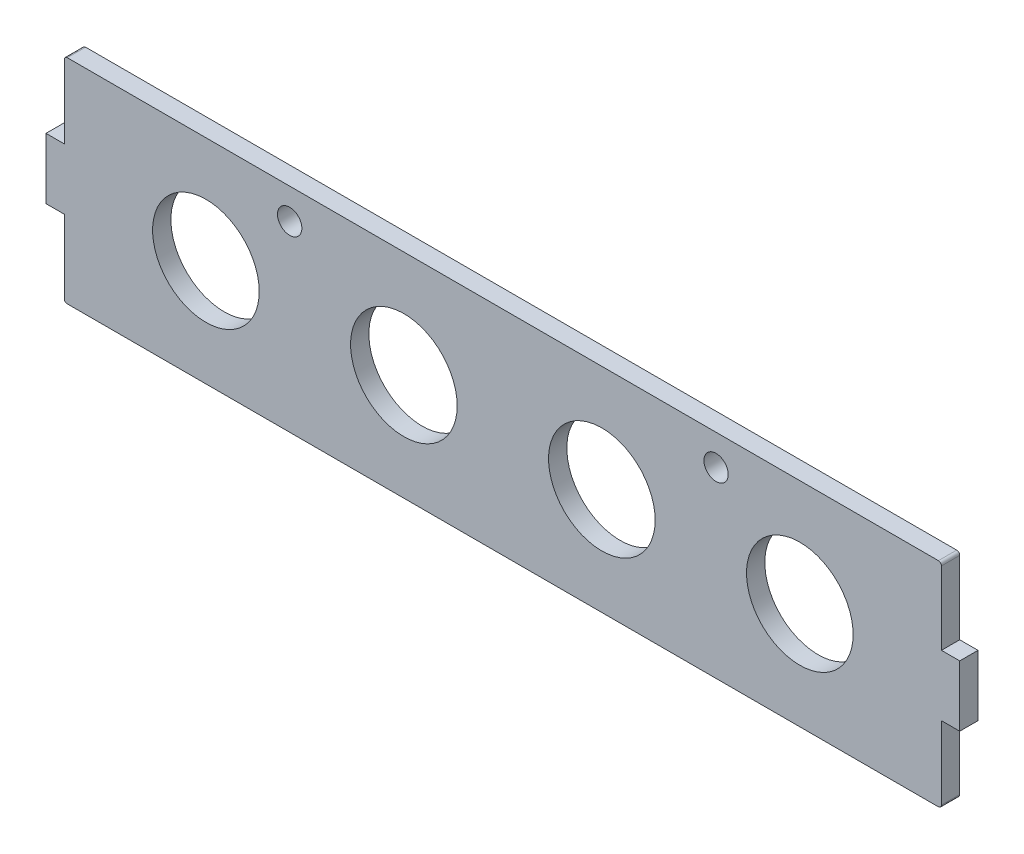
ISO-10303-21;
HEADER;
FILE_DESCRIPTION(('STEP AP214'),'2;1');
FILE_NAME('part.step','',(''),(''),'','','');
FILE_SCHEMA(('AUTOMOTIVE_DESIGN { 1 0 10303 214 1 1 1 1 }'));
ENDSEC;
DATA;
#1=APPLICATION_CONTEXT('core data for automotive mechanical design processes');
#2=APPLICATION_PROTOCOL_DEFINITION('international standard','automotive_design',2000,#1);
#3=PRODUCT_CONTEXT('',#1,'mechanical');
#4=PRODUCT('Part','Part','',(#3));
#5=PRODUCT_RELATED_PRODUCT_CATEGORY('part','',(#4));
#6=PRODUCT_DEFINITION_FORMATION('','',#4);
#7=PRODUCT_DEFINITION_CONTEXT('part definition',#1,'design');
#8=PRODUCT_DEFINITION('design','',#6,#7);
#9=PRODUCT_DEFINITION_SHAPE('','',#8);
#10=(LENGTH_UNIT() NAMED_UNIT(*) SI_UNIT(.MILLI.,.METRE.));
#11=(NAMED_UNIT(*) PLANE_ANGLE_UNIT() SI_UNIT($,.RADIAN.));
#12=(NAMED_UNIT(*) SI_UNIT($,.STERADIAN.) SOLID_ANGLE_UNIT());
#13=UNCERTAINTY_MEASURE_WITH_UNIT(LENGTH_MEASURE(1.E-05),#10,'distance_accuracy_value','');
#14=(GEOMETRIC_REPRESENTATION_CONTEXT(3) GLOBAL_UNCERTAINTY_ASSIGNED_CONTEXT((#13)) GLOBAL_UNIT_ASSIGNED_CONTEXT((#10,
#11,#12)) REPRESENTATION_CONTEXT('',''));
#15=CARTESIAN_POINT('',(0.,0.,0.));
#16=DIRECTION('',(0.,0.,1.));
#17=DIRECTION('',(1.,0.,0.));
#18=AXIS2_PLACEMENT_3D('',#15,#16,#17);
#19=CARTESIAN_POINT('',(0.,0.,-6.));
#20=DIRECTION('',(-1.,0.,0.));
#21=DIRECTION('',(0.,0.,1.));
#22=AXIS2_PLACEMENT_3D('',#19,#20,#21);
#23=PLANE('',#22);
#24=DIRECTION('',(0.,-1.,0.));
#25=VECTOR('',#24,1.);
#26=CARTESIAN_POINT('',(0.,0.,-6.));
#27=LINE('',#26,#25);
#28=CARTESIAN_POINT('',(0.,45.,-6.));
#29=VERTEX_POINT('',#28);
#30=CARTESIAN_POINT('',(0.,25.,-6.));
#31=VERTEX_POINT('',#30);
#32=EDGE_CURVE('E220',#29,#31,#27,.T.);
#33=ORIENTED_EDGE('',*,*,#32,.T.);
#34=DIRECTION('',(0.,0.,1.));
#35=VECTOR('',#34,1.);
#36=CARTESIAN_POINT('',(0.,25.,-6.));
#37=LINE('',#36,#35);
#38=CARTESIAN_POINT('',(0.,25.,0.));
#39=VERTEX_POINT('',#38);
#40=EDGE_CURVE('E186',#31,#39,#37,.T.);
#41=ORIENTED_EDGE('',*,*,#40,.T.);
#42=DIRECTION('',(0.,-1.,0.));
#43=VECTOR('',#42,1.);
#44=CARTESIAN_POINT('',(0.,0.,0.));
#45=LINE('',#44,#43);
#46=CARTESIAN_POINT('',(0.,45.,0.));
#47=VERTEX_POINT('',#46);
#48=EDGE_CURVE('E217',#47,#39,#45,.T.);
#49=ORIENTED_EDGE('',*,*,#48,.F.);
#50=DIRECTION('',(0.,0.,1.));
#51=VECTOR('',#50,1.);
#52=CARTESIAN_POINT('',(0.,45.,-6.));
#53=LINE('',#52,#51);
#54=EDGE_CURVE('E215',#29,#47,#53,.T.);
#55=ORIENTED_EDGE('',*,*,#54,.F.);
#56=EDGE_LOOP('',(#33,#41,#49,#55));
#57=FACE_BOUND('',#56,.T.);
#58=ADVANCED_FACE('F31',(#57),#23,.T.);
#59=CARTESIAN_POINT('',(0.,70.,-6.));
#60=DIRECTION('',(0.,0.,-1.));
#61=DIRECTION('',(-1.,0.,0.));
#62=AXIS2_PLACEMENT_3D('',#59,#60,#61);
#63=PLANE('',#62);
#64=CARTESIAN_POINT('',(247.5,35.,-6.));
#65=DIRECTION('',(0.,0.,1.));
#66=DIRECTION('',(1.,0.,0.));
#67=AXIS2_PLACEMENT_3D('',#64,#65,#66);
#68=CIRCLE('',#67,17.5);
#69=CARTESIAN_POINT('',(265.,35.,-6.));
#70=VERTEX_POINT('',#69);
#71=EDGE_CURVE('E326',#70,#70,#68,.T.);
#72=ORIENTED_EDGE('',*,*,#71,.T.);
#73=EDGE_LOOP('',(#72));
#74=FACE_BOUND('',#73,.T.);
#75=CARTESIAN_POINT('',(182.5,35.,-6.));
#76=DIRECTION('',(0.,0.,1.));
#77=DIRECTION('',(1.,0.,0.));
#78=AXIS2_PLACEMENT_3D('',#75,#76,#77);
#79=CIRCLE('',#78,17.5);
#80=CARTESIAN_POINT('',(200.,35.,-6.));
#81=VERTEX_POINT('',#80);
#82=EDGE_CURVE('E320',#81,#81,#79,.T.);
#83=ORIENTED_EDGE('',*,*,#82,.T.);
#84=EDGE_LOOP('',(#83));
#85=FACE_BOUND('',#84,.T.);
#86=CARTESIAN_POINT('',(117.5,35.,-6.));
#87=DIRECTION('',(0.,0.,1.));
#88=DIRECTION('',(1.,0.,0.));
#89=AXIS2_PLACEMENT_3D('',#86,#87,#88);
#90=CIRCLE('',#89,17.5);
#91=CARTESIAN_POINT('',(135.,35.,-6.));
#92=VERTEX_POINT('',#91);
#93=EDGE_CURVE('E314',#92,#92,#90,.T.);
#94=ORIENTED_EDGE('',*,*,#93,.T.);
#95=EDGE_LOOP('',(#94));
#96=FACE_BOUND('',#95,.T.);
#97=CARTESIAN_POINT('',(52.5,35.,-6.));
#98=DIRECTION('',(0.,0.,1.));
#99=DIRECTION('',(1.,0.,0.));
#100=AXIS2_PLACEMENT_3D('',#97,#98,#99);
#101=CIRCLE('',#100,17.5);
#102=CARTESIAN_POINT('',(70.,35.,-6.));
#103=VERTEX_POINT('',#102);
#104=EDGE_CURVE('E308',#103,#103,#101,.T.);
#105=ORIENTED_EDGE('',*,*,#104,.T.);
#106=EDGE_LOOP('',(#105));
#107=FACE_BOUND('',#106,.T.);
#108=CARTESIAN_POINT('',(220.,60.,-6.));
#109=DIRECTION('',(0.,0.,1.));
#110=DIRECTION('',(1.,0.,0.));
#111=AXIS2_PLACEMENT_3D('',#108,#109,#110);
#112=CIRCLE('',#111,3.99999999999999);
#113=CARTESIAN_POINT('',(224.,60.,-6.));
#114=VERTEX_POINT('',#113);
#115=EDGE_CURVE('E305',#114,#114,#112,.T.);
#116=ORIENTED_EDGE('',*,*,#115,.T.);
#117=EDGE_LOOP('',(#116));
#118=FACE_BOUND('',#117,.T.);
#119=CARTESIAN_POINT('',(80.,60.,-6.));
#120=DIRECTION('',(0.,0.,1.));
#121=DIRECTION('',(1.,0.,0.));
#122=AXIS2_PLACEMENT_3D('',#119,#120,#121);
#123=CIRCLE('',#122,4.00000000000001);
#124=CARTESIAN_POINT('',(84.,60.,-6.));
#125=VERTEX_POINT('',#124);
#126=EDGE_CURVE('E299',#125,#125,#123,.T.);
#127=ORIENTED_EDGE('',*,*,#126,.T.);
#128=EDGE_LOOP('',(#127));
#129=FACE_BOUND('',#128,.T.);
#130=DIRECTION('',(0.,-1.,0.));
#131=VECTOR('',#130,1.);
#132=CARTESIAN_POINT('',(294.,25.,-6.));
#133=LINE('',#132,#131);
#134=CARTESIAN_POINT('',(294.,25.,-6.));
#135=VERTEX_POINT('',#134);
#136=CARTESIAN_POINT('',(294.,1.,-6.));
#137=VERTEX_POINT('',#136);
#138=EDGE_CURVE('E151',#135,#137,#133,.T.);
#139=ORIENTED_EDGE('',*,*,#138,.T.);
#140=CARTESIAN_POINT('',(293.,1.,-6.));
#141=DIRECTION('',(0.,0.,-1.));
#142=DIRECTION('',(-1.,0.,0.));
#143=AXIS2_PLACEMENT_3D('',#140,#141,#142);
#144=CIRCLE('',#143,1.);
#145=CARTESIAN_POINT('',(293.,0.,-6.));
#146=VERTEX_POINT('',#145);
#147=EDGE_CURVE('E257',#137,#146,#144,.T.);
#148=ORIENTED_EDGE('',*,*,#147,.T.);
#149=DIRECTION('',(1.,0.,0.));
#150=VECTOR('',#149,1.);
#151=CARTESIAN_POINT('',(0.,0.,-6.));
#152=LINE('',#151,#150);
#153=CARTESIAN_POINT('',(7.00000000000002,0.,-6.));
#154=VERTEX_POINT('',#153);
#155=EDGE_CURVE('E223',#154,#146,#152,.T.);
#156=ORIENTED_EDGE('',*,*,#155,.F.);
#157=CARTESIAN_POINT('',(7.00000000000002,1.,-6.));
#158=DIRECTION('',(0.,0.,-1.));
#159=DIRECTION('',(-1.,0.,0.));
#160=AXIS2_PLACEMENT_3D('',#157,#158,#159);
#161=CIRCLE('',#160,1.);
#162=CARTESIAN_POINT('',(6.00000000000002,1.,-6.));
#163=VERTEX_POINT('',#162);
#164=EDGE_CURVE('E254',#154,#163,#161,.T.);
#165=ORIENTED_EDGE('',*,*,#164,.T.);
#166=DIRECTION('',(0.,-1.,0.));
#167=VECTOR('',#166,1.);
#168=CARTESIAN_POINT('',(6.00000000000003,-204.754651374949,-6.));
#169=LINE('',#168,#167);
#170=CARTESIAN_POINT('',(6.00000000000001,25.,-6.));
#171=VERTEX_POINT('',#170);
#172=EDGE_CURVE('E199',#171,#163,#169,.T.);
#173=ORIENTED_EDGE('',*,*,#172,.F.);
#174=DIRECTION('',(1.,0.,0.));
#175=VECTOR('',#174,1.);
#176=CARTESIAN_POINT('',(150.,25.,-6.));
#177=LINE('',#176,#175);
#178=EDGE_CURVE('E192',#31,#171,#177,.T.);
#179=ORIENTED_EDGE('',*,*,#178,.F.);
#180=ORIENTED_EDGE('',*,*,#32,.F.);
#181=DIRECTION('',(-1.,0.,0.));
#182=VECTOR('',#181,1.);
#183=CARTESIAN_POINT('',(150.,45.,-6.));
#184=LINE('',#183,#182);
#185=CARTESIAN_POINT('',(6.,45.,-6.));
#186=VERTEX_POINT('',#185);
#187=EDGE_CURVE('E206',#186,#29,#184,.T.);
#188=ORIENTED_EDGE('',*,*,#187,.F.);
#189=DIRECTION('',(0.,-1.,0.));
#190=VECTOR('',#189,1.);
#191=CARTESIAN_POINT('',(5.99999999999995,-204.754651374949,-6.));
#192=LINE('',#191,#190);
#193=CARTESIAN_POINT('',(6.00000000000001,69.,-6.));
#194=VERTEX_POINT('',#193);
#195=EDGE_CURVE('E208',#194,#186,#192,.T.);
#196=ORIENTED_EDGE('',*,*,#195,.F.);
#197=CARTESIAN_POINT('',(7.00000000000001,69.,-6.));
#198=DIRECTION('',(0.,0.,-1.));
#199=DIRECTION('',(-1.,0.,0.));
#200=AXIS2_PLACEMENT_3D('',#197,#198,#199);
#201=CIRCLE('',#200,1.);
#202=CARTESIAN_POINT('',(7.00000000000001,70.,-6.));
#203=VERTEX_POINT('',#202);
#204=EDGE_CURVE('E52',#194,#203,#201,.T.);
#205=ORIENTED_EDGE('',*,*,#204,.T.);
#206=DIRECTION('',(-1.,0.,0.));
#207=VECTOR('',#206,1.);
#208=CARTESIAN_POINT('',(0.,70.,-6.));
#209=LINE('',#208,#207);
#210=CARTESIAN_POINT('',(293.,70.,-6.));
#211=VERTEX_POINT('',#210);
#212=EDGE_CURVE('E229',#211,#203,#209,.T.);
#213=ORIENTED_EDGE('',*,*,#212,.F.);
#214=CARTESIAN_POINT('',(293.,69.,-6.));
#215=DIRECTION('',(0.,0.,-1.));
#216=DIRECTION('',(-1.,0.,0.));
#217=AXIS2_PLACEMENT_3D('',#214,#215,#216);
#218=CIRCLE('',#217,1.);
#219=CARTESIAN_POINT('',(294.,69.,-6.));
#220=VERTEX_POINT('',#219);
#221=EDGE_CURVE('E46',#211,#220,#218,.T.);
#222=ORIENTED_EDGE('',*,*,#221,.T.);
#223=DIRECTION('',(0.,-1.,0.));
#224=VECTOR('',#223,1.);
#225=CARTESIAN_POINT('',(294.,70.,-6.));
#226=LINE('',#225,#224);
#227=CARTESIAN_POINT('',(294.,45.,-6.));
#228=VERTEX_POINT('',#227);
#229=EDGE_CURVE('E177',#220,#228,#226,.T.);
#230=ORIENTED_EDGE('',*,*,#229,.T.);
#231=DIRECTION('',(1.,0.,0.));
#232=VECTOR('',#231,1.);
#233=CARTESIAN_POINT('',(294.,45.,-6.));
#234=LINE('',#233,#232);
#235=CARTESIAN_POINT('',(300.,45.,-6.));
#236=VERTEX_POINT('',#235);
#237=EDGE_CURVE('E183',#228,#236,#234,.T.);
#238=ORIENTED_EDGE('',*,*,#237,.T.);
#239=DIRECTION('',(0.,1.,0.));
#240=VECTOR('',#239,1.);
#241=CARTESIAN_POINT('',(300.,0.,-6.));
#242=LINE('',#241,#240);
#243=CARTESIAN_POINT('',(300.,25.,-6.));
#244=VERTEX_POINT('',#243);
#245=EDGE_CURVE('E227',#244,#236,#242,.T.);
#246=ORIENTED_EDGE('',*,*,#245,.F.);
#247=DIRECTION('',(-1.,0.,0.));
#248=VECTOR('',#247,1.);
#249=CARTESIAN_POINT('',(300.,25.,-6.));
#250=LINE('',#249,#248);
#251=EDGE_CURVE('E168',#244,#135,#250,.T.);
#252=ORIENTED_EDGE('',*,*,#251,.T.);
#253=EDGE_LOOP('',(#139,#148,#156,#165,#173,#179,#180,#188,#196,#205,#213,#222,#230,#238,#246,#252));
#254=FACE_BOUND('',#253,.T.);
#255=ADVANCED_FACE('F284',(#74,#85,#96,#107,#118,#129,#254),#63,.T.);
#256=CARTESIAN_POINT('',(0.,70.,0.));
#257=DIRECTION('',(0.,0.,-1.));
#258=DIRECTION('',(-1.,0.,0.));
#259=AXIS2_PLACEMENT_3D('',#256,#257,#258);
#260=PLANE('',#259);
#261=CARTESIAN_POINT('',(247.5,35.,0.));
#262=DIRECTION('',(0.,0.,1.));
#263=DIRECTION('',(1.,0.,0.));
#264=AXIS2_PLACEMENT_3D('',#261,#262,#263);
#265=CIRCLE('',#264,17.5);
#266=CARTESIAN_POINT('',(265.,35.,0.));
#267=VERTEX_POINT('',#266);
#268=EDGE_CURVE('E329',#267,#267,#265,.T.);
#269=ORIENTED_EDGE('',*,*,#268,.F.);
#270=EDGE_LOOP('',(#269));
#271=FACE_BOUND('',#270,.T.);
#272=CARTESIAN_POINT('',(182.5,35.,0.));
#273=DIRECTION('',(0.,0.,1.));
#274=DIRECTION('',(1.,0.,0.));
#275=AXIS2_PLACEMENT_3D('',#272,#273,#274);
#276=CIRCLE('',#275,17.5);
#277=CARTESIAN_POINT('',(200.,35.,0.));
#278=VERTEX_POINT('',#277);
#279=EDGE_CURVE('E323',#278,#278,#276,.T.);
#280=ORIENTED_EDGE('',*,*,#279,.F.);
#281=EDGE_LOOP('',(#280));
#282=FACE_BOUND('',#281,.T.);
#283=CARTESIAN_POINT('',(117.5,35.,0.));
#284=DIRECTION('',(0.,0.,1.));
#285=DIRECTION('',(1.,0.,0.));
#286=AXIS2_PLACEMENT_3D('',#283,#284,#285);
#287=CIRCLE('',#286,17.5);
#288=CARTESIAN_POINT('',(135.,35.,0.));
#289=VERTEX_POINT('',#288);
#290=EDGE_CURVE('E317',#289,#289,#287,.T.);
#291=ORIENTED_EDGE('',*,*,#290,.F.);
#292=EDGE_LOOP('',(#291));
#293=FACE_BOUND('',#292,.T.);
#294=CARTESIAN_POINT('',(52.5,35.,0.));
#295=DIRECTION('',(0.,0.,1.));
#296=DIRECTION('',(1.,0.,0.));
#297=AXIS2_PLACEMENT_3D('',#294,#295,#296);
#298=CIRCLE('',#297,17.5);
#299=CARTESIAN_POINT('',(70.,35.,0.));
#300=VERTEX_POINT('',#299);
#301=EDGE_CURVE('E311',#300,#300,#298,.T.);
#302=ORIENTED_EDGE('',*,*,#301,.F.);
#303=EDGE_LOOP('',(#302));
#304=FACE_BOUND('',#303,.T.);
#305=CARTESIAN_POINT('',(220.,60.,0.));
#306=DIRECTION('',(0.,0.,1.));
#307=DIRECTION('',(1.,0.,0.));
#308=AXIS2_PLACEMENT_3D('',#305,#306,#307);
#309=CIRCLE('',#308,3.99999999999999);
#310=CARTESIAN_POINT('',(224.,60.,0.));
#311=VERTEX_POINT('',#310);
#312=EDGE_CURVE('E302',#311,#311,#309,.T.);
#313=ORIENTED_EDGE('',*,*,#312,.F.);
#314=EDGE_LOOP('',(#313));
#315=FACE_BOUND('',#314,.T.);
#316=CARTESIAN_POINT('',(80.,60.,0.));
#317=DIRECTION('',(0.,0.,1.));
#318=DIRECTION('',(1.,0.,0.));
#319=AXIS2_PLACEMENT_3D('',#316,#317,#318);
#320=CIRCLE('',#319,4.00000000000001);
#321=CARTESIAN_POINT('',(84.,60.,0.));
#322=VERTEX_POINT('',#321);
#323=EDGE_CURVE('E155',#322,#322,#320,.T.);
#324=ORIENTED_EDGE('',*,*,#323,.F.);
#325=EDGE_LOOP('',(#324));
#326=FACE_BOUND('',#325,.T.);
#327=DIRECTION('',(1.,0.,0.));
#328=VECTOR('',#327,1.);
#329=CARTESIAN_POINT('',(0.,0.,0.));
#330=LINE('',#329,#328);
#331=CARTESIAN_POINT('',(7.00000000000002,0.,0.));
#332=VERTEX_POINT('',#331);
#333=CARTESIAN_POINT('',(293.,0.,0.));
#334=VERTEX_POINT('',#333);
#335=EDGE_CURVE('E234',#332,#334,#330,.T.);
#336=ORIENTED_EDGE('',*,*,#335,.T.);
#337=CARTESIAN_POINT('',(293.,1.,0.));
#338=DIRECTION('',(0.,0.,-1.));
#339=DIRECTION('',(-1.,0.,0.));
#340=AXIS2_PLACEMENT_3D('',#337,#338,#339);
#341=CIRCLE('',#340,1.);
#342=CARTESIAN_POINT('',(294.,1.,0.));
#343=VERTEX_POINT('',#342);
#344=EDGE_CURVE('E167',#334,#343,#341,.F.);
#345=ORIENTED_EDGE('',*,*,#344,.T.);
#346=DIRECTION('',(0.,-1.,0.));
#347=VECTOR('',#346,1.);
#348=CARTESIAN_POINT('',(294.,25.,0.));
#349=LINE('',#348,#347);
#350=CARTESIAN_POINT('',(294.,25.,0.));
#351=VERTEX_POINT('',#350);
#352=EDGE_CURVE('E148',#351,#343,#349,.T.);
#353=ORIENTED_EDGE('',*,*,#352,.F.);
#354=DIRECTION('',(-1.,0.,0.));
#355=VECTOR('',#354,1.);
#356=CARTESIAN_POINT('',(300.,25.,0.));
#357=LINE('',#356,#355);
#358=CARTESIAN_POINT('',(300.,25.,0.));
#359=VERTEX_POINT('',#358);
#360=EDGE_CURVE('E158',#359,#351,#357,.T.);
#361=ORIENTED_EDGE('',*,*,#360,.F.);
#362=DIRECTION('',(0.,1.,0.));
#363=VECTOR('',#362,1.);
#364=CARTESIAN_POINT('',(300.,0.,0.));
#365=LINE('',#364,#363);
#366=CARTESIAN_POINT('',(300.,45.,0.));
#367=VERTEX_POINT('',#366);
#368=EDGE_CURVE('E236',#359,#367,#365,.T.);
#369=ORIENTED_EDGE('',*,*,#368,.T.);
#370=DIRECTION('',(1.,0.,0.));
#371=VECTOR('',#370,1.);
#372=CARTESIAN_POINT('',(294.,45.,0.));
#373=LINE('',#372,#371);
#374=CARTESIAN_POINT('',(294.,45.,0.));
#375=VERTEX_POINT('',#374);
#376=EDGE_CURVE('E182',#375,#367,#373,.T.);
#377=ORIENTED_EDGE('',*,*,#376,.F.);
#378=DIRECTION('',(0.,-1.,0.));
#379=VECTOR('',#378,1.);
#380=CARTESIAN_POINT('',(294.,70.,0.));
#381=LINE('',#380,#379);
#382=CARTESIAN_POINT('',(294.,69.,0.));
#383=VERTEX_POINT('',#382);
#384=EDGE_CURVE('E180',#383,#375,#381,.T.);
#385=ORIENTED_EDGE('',*,*,#384,.F.);
#386=CARTESIAN_POINT('',(293.,69.,0.));
#387=DIRECTION('',(0.,0.,-1.));
#388=DIRECTION('',(-1.,0.,0.));
#389=AXIS2_PLACEMENT_3D('',#386,#387,#388);
#390=CIRCLE('',#389,1.);
#391=CARTESIAN_POINT('',(293.,70.,0.));
#392=VERTEX_POINT('',#391);
#393=EDGE_CURVE('E248',#383,#392,#390,.F.);
#394=ORIENTED_EDGE('',*,*,#393,.T.);
#395=DIRECTION('',(-1.,0.,0.));
#396=VECTOR('',#395,1.);
#397=CARTESIAN_POINT('',(0.,70.,0.));
#398=LINE('',#397,#396);
#399=CARTESIAN_POINT('',(7.00000000000001,70.,0.));
#400=VERTEX_POINT('',#399);
#401=EDGE_CURVE('E224',#392,#400,#398,.T.);
#402=ORIENTED_EDGE('',*,*,#401,.T.);
#403=CARTESIAN_POINT('',(7.00000000000001,69.,0.));
#404=DIRECTION('',(0.,0.,-1.));
#405=DIRECTION('',(-1.,0.,0.));
#406=AXIS2_PLACEMENT_3D('',#403,#404,#405);
#407=CIRCLE('',#406,1.);
#408=CARTESIAN_POINT('',(6.00000000000001,69.,0.));
#409=VERTEX_POINT('',#408);
#410=EDGE_CURVE('E244',#400,#409,#407,.F.);
#411=ORIENTED_EDGE('',*,*,#410,.T.);
#412=DIRECTION('',(0.,-1.,0.));
#413=VECTOR('',#412,1.);
#414=CARTESIAN_POINT('',(5.99999999999995,-204.754651374949,0.));
#415=LINE('',#414,#413);
#416=CARTESIAN_POINT('',(6.,45.,0.));
#417=VERTEX_POINT('',#416);
#418=EDGE_CURVE('E209',#409,#417,#415,.T.);
#419=ORIENTED_EDGE('',*,*,#418,.T.);
#420=DIRECTION('',(-1.,0.,0.));
#421=VECTOR('',#420,1.);
#422=CARTESIAN_POINT('',(150.,45.,0.));
#423=LINE('',#422,#421);
#424=EDGE_CURVE('E202',#417,#47,#423,.T.);
#425=ORIENTED_EDGE('',*,*,#424,.T.);
#426=ORIENTED_EDGE('',*,*,#48,.T.);
#427=DIRECTION('',(1.,0.,0.));
#428=VECTOR('',#427,1.);
#429=CARTESIAN_POINT('',(150.,25.,0.));
#430=LINE('',#429,#428);
#431=CARTESIAN_POINT('',(6.00000000000001,25.,0.));
#432=VERTEX_POINT('',#431);
#433=EDGE_CURVE('E195',#39,#432,#430,.T.);
#434=ORIENTED_EDGE('',*,*,#433,.T.);
#435=DIRECTION('',(0.,-1.,0.));
#436=VECTOR('',#435,1.);
#437=CARTESIAN_POINT('',(6.00000000000003,-204.754651374949,0.));
#438=LINE('',#437,#436);
#439=CARTESIAN_POINT('',(6.00000000000002,1.,0.));
#440=VERTEX_POINT('',#439);
#441=EDGE_CURVE('E198',#432,#440,#438,.T.);
#442=ORIENTED_EDGE('',*,*,#441,.T.);
#443=CARTESIAN_POINT('',(7.00000000000002,1.,0.));
#444=DIRECTION('',(0.,0.,-1.));
#445=DIRECTION('',(-1.,0.,0.));
#446=AXIS2_PLACEMENT_3D('',#443,#444,#445);
#447=CIRCLE('',#446,1.);
#448=EDGE_CURVE('E246',#440,#332,#447,.F.);
#449=ORIENTED_EDGE('',*,*,#448,.T.);
#450=EDGE_LOOP('',(#336,#345,#353,#361,#369,#377,#385,#394,#402,#411,#419,#425,#426,#434,#442,#449));
#451=FACE_BOUND('',#450,.T.);
#452=ADVANCED_FACE('F166',(#271,#282,#293,#304,#315,#326,#451),#260,.F.);
#453=CARTESIAN_POINT('',(0.,0.,-6.));
#454=DIRECTION('',(0.,-1.,0.));
#455=DIRECTION('',(0.,0.,-1.));
#456=AXIS2_PLACEMENT_3D('',#453,#454,#455);
#457=PLANE('',#456);
#458=ORIENTED_EDGE('',*,*,#155,.T.);
#459=DIRECTION('',(0.,0.,1.));
#460=VECTOR('',#459,1.);
#461=CARTESIAN_POINT('',(293.,0.,0.));
#462=LINE('',#461,#460);
#463=EDGE_CURVE('E241',#146,#334,#462,.T.);
#464=ORIENTED_EDGE('',*,*,#463,.T.);
#465=ORIENTED_EDGE('',*,*,#335,.F.);
#466=DIRECTION('',(0.,0.,1.));
#467=VECTOR('',#466,1.);
#468=CARTESIAN_POINT('',(7.00000000000002,0.,-6.));
#469=LINE('',#468,#467);
#470=EDGE_CURVE('E231',#332,#154,#469,.F.);
#471=ORIENTED_EDGE('',*,*,#470,.T.);
#472=EDGE_LOOP('',(#458,#464,#465,#471));
#473=FACE_BOUND('',#472,.T.);
#474=ADVANCED_FACE('F289',(#473),#457,.T.);
#475=CARTESIAN_POINT('',(0.,70.,-6.));
#476=DIRECTION('',(0.,1.,0.));
#477=DIRECTION('',(0.,0.,1.));
#478=AXIS2_PLACEMENT_3D('',#475,#476,#477);
#479=PLANE('',#478);
#480=ORIENTED_EDGE('',*,*,#401,.F.);
#481=DIRECTION('',(0.,0.,1.));
#482=VECTOR('',#481,1.);
#483=CARTESIAN_POINT('',(293.,70.,-6.));
#484=LINE('',#483,#482);
#485=EDGE_CURVE('E265',#392,#211,#484,.F.);
#486=ORIENTED_EDGE('',*,*,#485,.T.);
#487=ORIENTED_EDGE('',*,*,#212,.T.);
#488=DIRECTION('',(0.,0.,1.));
#489=VECTOR('',#488,1.);
#490=CARTESIAN_POINT('',(7.00000000000001,70.,-6.));
#491=LINE('',#490,#489);
#492=EDGE_CURVE('E262',#203,#400,#491,.T.);
#493=ORIENTED_EDGE('',*,*,#492,.T.);
#494=EDGE_LOOP('',(#480,#486,#487,#493));
#495=FACE_BOUND('',#494,.T.);
#496=ADVANCED_FACE('F401',(#495),#479,.T.);
#497=CARTESIAN_POINT('',(300.,0.,-6.));
#498=DIRECTION('',(1.,0.,0.));
#499=DIRECTION('',(0.,0.,-1.));
#500=AXIS2_PLACEMENT_3D('',#497,#498,#499);
#501=PLANE('',#500);
#502=DIRECTION('',(0.,0.,1.));
#503=VECTOR('',#502,1.);
#504=CARTESIAN_POINT('',(300.,25.,-6.));
#505=LINE('',#504,#503);
#506=EDGE_CURVE('E154',#244,#359,#505,.T.);
#507=ORIENTED_EDGE('',*,*,#506,.F.);
#508=ORIENTED_EDGE('',*,*,#245,.T.);
#509=DIRECTION('',(0.,0.,1.));
#510=VECTOR('',#509,1.);
#511=CARTESIAN_POINT('',(300.,45.,-6.));
#512=LINE('',#511,#510);
#513=EDGE_CURVE('E174',#236,#367,#512,.T.);
#514=ORIENTED_EDGE('',*,*,#513,.T.);
#515=ORIENTED_EDGE('',*,*,#368,.F.);
#516=EDGE_LOOP('',(#507,#508,#514,#515));
#517=FACE_BOUND('',#516,.T.);
#518=ADVANCED_FACE('F296',(#517),#501,.T.);
#519=CARTESIAN_POINT('',(150.,45.,-6.));
#520=DIRECTION('',(0.,1.,0.));
#521=DIRECTION('',(0.,0.,1.));
#522=AXIS2_PLACEMENT_3D('',#519,#520,#521);
#523=PLANE('',#522);
#524=ORIENTED_EDGE('',*,*,#424,.F.);
#525=DIRECTION('',(0.,0.,1.));
#526=VECTOR('',#525,1.);
#527=CARTESIAN_POINT('',(6.,45.,-6.));
#528=LINE('',#527,#526);
#529=EDGE_CURVE('E211',#186,#417,#528,.T.);
#530=ORIENTED_EDGE('',*,*,#529,.F.);
#531=ORIENTED_EDGE('',*,*,#187,.T.);
#532=ORIENTED_EDGE('',*,*,#54,.T.);
#533=EDGE_LOOP('',(#524,#530,#531,#532));
#534=FACE_BOUND('',#533,.T.);
#535=ADVANCED_FACE('F428',(#534),#523,.T.);
#536=CARTESIAN_POINT('',(5.99999999999995,-204.754651374949,-6.));
#537=DIRECTION('',(-1.,0.,0.));
#538=DIRECTION('',(0.,-1.,0.));
#539=AXIS2_PLACEMENT_3D('',#536,#537,#538);
#540=PLANE('',#539);
#541=ORIENTED_EDGE('',*,*,#418,.F.);
#542=DIRECTION('',(0.,0.,1.));
#543=VECTOR('',#542,1.);
#544=CARTESIAN_POINT('',(6.00000000000001,69.,-6.));
#545=LINE('',#544,#543);
#546=EDGE_CURVE('E11',#409,#194,#545,.F.);
#547=ORIENTED_EDGE('',*,*,#546,.T.);
#548=ORIENTED_EDGE('',*,*,#195,.T.);
#549=ORIENTED_EDGE('',*,*,#529,.T.);
#550=EDGE_LOOP('',(#541,#547,#548,#549));
#551=FACE_BOUND('',#550,.T.);
#552=ADVANCED_FACE('F424',(#551),#540,.T.);
#553=CARTESIAN_POINT('',(6.00000000000003,-204.754651374949,-6.));
#554=DIRECTION('',(-1.,0.,0.));
#555=DIRECTION('',(0.,-1.,0.));
#556=AXIS2_PLACEMENT_3D('',#553,#554,#555);
#557=PLANE('',#556);
#558=ORIENTED_EDGE('',*,*,#172,.T.);
#559=DIRECTION('',(0.,0.,1.));
#560=VECTOR('',#559,1.);
#561=CARTESIAN_POINT('',(6.00000000000002,1.,-6.));
#562=LINE('',#561,#560);
#563=EDGE_CURVE('E39',#163,#440,#562,.T.);
#564=ORIENTED_EDGE('',*,*,#563,.T.);
#565=ORIENTED_EDGE('',*,*,#441,.F.);
#566=DIRECTION('',(0.,0.,1.));
#567=VECTOR('',#566,1.);
#568=CARTESIAN_POINT('',(6.00000000000001,25.,-6.));
#569=LINE('',#568,#567);
#570=EDGE_CURVE('E190',#171,#432,#569,.T.);
#571=ORIENTED_EDGE('',*,*,#570,.F.);
#572=EDGE_LOOP('',(#558,#564,#565,#571));
#573=FACE_BOUND('',#572,.T.);
#574=ADVANCED_FACE('F270',(#573),#557,.T.);
#575=CARTESIAN_POINT('',(150.,25.,-6.));
#576=DIRECTION('',(0.,-1.,0.));
#577=DIRECTION('',(0.,0.,-1.));
#578=AXIS2_PLACEMENT_3D('',#575,#576,#577);
#579=PLANE('',#578);
#580=ORIENTED_EDGE('',*,*,#433,.F.);
#581=ORIENTED_EDGE('',*,*,#40,.F.);
#582=ORIENTED_EDGE('',*,*,#178,.T.);
#583=ORIENTED_EDGE('',*,*,#570,.T.);
#584=EDGE_LOOP('',(#580,#581,#582,#583));
#585=FACE_BOUND('',#584,.T.);
#586=ADVANCED_FACE('F278',(#585),#579,.T.);
#587=CARTESIAN_POINT('',(294.,45.,-6.));
#588=DIRECTION('',(0.,-1.,0.));
#589=DIRECTION('',(0.,0.,-1.));
#590=AXIS2_PLACEMENT_3D('',#587,#588,#589);
#591=PLANE('',#590);
#592=ORIENTED_EDGE('',*,*,#376,.T.);
#593=ORIENTED_EDGE('',*,*,#513,.F.);
#594=ORIENTED_EDGE('',*,*,#237,.F.);
#595=DIRECTION('',(0.,0.,1.));
#596=VECTOR('',#595,1.);
#597=CARTESIAN_POINT('',(294.,45.,-6.));
#598=LINE('',#597,#596);
#599=EDGE_CURVE('E163',#228,#375,#598,.T.);
#600=ORIENTED_EDGE('',*,*,#599,.T.);
#601=EDGE_LOOP('',(#592,#593,#594,#600));
#602=FACE_BOUND('',#601,.T.);
#603=ADVANCED_FACE('F412',(#602),#591,.F.);
#604=CARTESIAN_POINT('',(294.,70.,-6.));
#605=DIRECTION('',(-1.,0.,0.));
#606=DIRECTION('',(0.,0.,1.));
#607=AXIS2_PLACEMENT_3D('',#604,#605,#606);
#608=PLANE('',#607);
#609=ORIENTED_EDGE('',*,*,#229,.F.);
#610=DIRECTION('',(0.,0.,1.));
#611=VECTOR('',#610,1.);
#612=CARTESIAN_POINT('',(294.,69.,0.));
#613=LINE('',#612,#611);
#614=EDGE_CURVE('E259',#220,#383,#613,.T.);
#615=ORIENTED_EDGE('',*,*,#614,.T.);
#616=ORIENTED_EDGE('',*,*,#384,.T.);
#617=ORIENTED_EDGE('',*,*,#599,.F.);
#618=EDGE_LOOP('',(#609,#615,#616,#617));
#619=FACE_BOUND('',#618,.T.);
#620=ADVANCED_FACE('F408',(#619),#608,.F.);
#621=CARTESIAN_POINT('',(294.,25.,-6.));
#622=DIRECTION('',(-1.,0.,0.));
#623=DIRECTION('',(0.,0.,1.));
#624=AXIS2_PLACEMENT_3D('',#621,#622,#623);
#625=PLANE('',#624);
#626=ORIENTED_EDGE('',*,*,#352,.T.);
#627=DIRECTION('',(0.,0.,1.));
#628=VECTOR('',#627,1.);
#629=CARTESIAN_POINT('',(294.,1.,-6.));
#630=LINE('',#629,#628);
#631=EDGE_CURVE('E251',#343,#137,#630,.F.);
#632=ORIENTED_EDGE('',*,*,#631,.T.);
#633=ORIENTED_EDGE('',*,*,#138,.F.);
#634=DIRECTION('',(0.,0.,1.));
#635=VECTOR('',#634,1.);
#636=CARTESIAN_POINT('',(294.,25.,-6.));
#637=LINE('',#636,#635);
#638=EDGE_CURVE('E144',#135,#351,#637,.T.);
#639=ORIENTED_EDGE('',*,*,#638,.T.);
#640=EDGE_LOOP('',(#626,#632,#633,#639));
#641=FACE_BOUND('',#640,.T.);
#642=ADVANCED_FACE('F146',(#641),#625,.F.);
#643=CARTESIAN_POINT('',(300.,25.,-6.));
#644=DIRECTION('',(0.,1.,0.));
#645=DIRECTION('',(0.,0.,1.));
#646=AXIS2_PLACEMENT_3D('',#643,#644,#645);
#647=PLANE('',#646);
#648=ORIENTED_EDGE('',*,*,#360,.T.);
#649=ORIENTED_EDGE('',*,*,#638,.F.);
#650=ORIENTED_EDGE('',*,*,#251,.F.);
#651=ORIENTED_EDGE('',*,*,#506,.T.);
#652=EDGE_LOOP('',(#648,#649,#650,#651));
#653=FACE_BOUND('',#652,.T.);
#654=ADVANCED_FACE('F159',(#653),#647,.F.);
#655=CARTESIAN_POINT('',(80.,60.,-6.));
#656=DIRECTION('',(0.,0.,1.));
#657=DIRECTION('',(1.,0.,0.));
#658=AXIS2_PLACEMENT_3D('',#655,#656,#657);
#659=CYLINDRICAL_SURFACE('',#658,4.00000000000001);
#660=ORIENTED_EDGE('',*,*,#126,.F.);
#661=EDGE_LOOP('',(#660));
#662=FACE_BOUND('',#661,.T.);
#663=ORIENTED_EDGE('',*,*,#323,.T.);
#664=EDGE_LOOP('',(#663));
#665=FACE_BOUND('',#664,.T.);
#666=ADVANCED_FACE('F357',(#662,#665),#659,.F.);
#667=CARTESIAN_POINT('',(220.,60.,-6.));
#668=DIRECTION('',(0.,0.,1.));
#669=DIRECTION('',(1.,0.,0.));
#670=AXIS2_PLACEMENT_3D('',#667,#668,#669);
#671=CYLINDRICAL_SURFACE('',#670,3.99999999999999);
#672=ORIENTED_EDGE('',*,*,#115,.F.);
#673=EDGE_LOOP('',(#672));
#674=FACE_BOUND('',#673,.T.);
#675=ORIENTED_EDGE('',*,*,#312,.T.);
#676=EDGE_LOOP('',(#675));
#677=FACE_BOUND('',#676,.T.);
#678=ADVANCED_FACE('F359',(#674,#677),#671,.F.);
#679=CARTESIAN_POINT('',(293.,1.,-6.));
#680=DIRECTION('',(0.,0.,-1.));
#681=DIRECTION('',(-1.,0.,0.));
#682=AXIS2_PLACEMENT_3D('',#679,#680,#681);
#683=CYLINDRICAL_SURFACE('',#682,1.);
#684=ORIENTED_EDGE('',*,*,#147,.F.);
#685=ORIENTED_EDGE('',*,*,#631,.F.);
#686=ORIENTED_EDGE('',*,*,#344,.F.);
#687=ORIENTED_EDGE('',*,*,#463,.F.);
#688=EDGE_LOOP('',(#684,#685,#686,#687));
#689=FACE_BOUND('',#688,.T.);
#690=ADVANCED_FACE('F293',(#689),#683,.T.);
#691=CARTESIAN_POINT('',(293.,69.,-6.));
#692=DIRECTION('',(0.,0.,-1.));
#693=DIRECTION('',(-1.,0.,0.));
#694=AXIS2_PLACEMENT_3D('',#691,#692,#693);
#695=CYLINDRICAL_SURFACE('',#694,1.);
#696=ORIENTED_EDGE('',*,*,#221,.F.);
#697=ORIENTED_EDGE('',*,*,#485,.F.);
#698=ORIENTED_EDGE('',*,*,#393,.F.);
#699=ORIENTED_EDGE('',*,*,#614,.F.);
#700=EDGE_LOOP('',(#696,#697,#698,#699));
#701=FACE_BOUND('',#700,.T.);
#702=ADVANCED_FACE('F382',(#701),#695,.T.);
#703=CARTESIAN_POINT('',(7.00000000000002,1.,-6.));
#704=DIRECTION('',(0.,0.,1.));
#705=DIRECTION('',(1.,0.,0.));
#706=AXIS2_PLACEMENT_3D('',#703,#704,#705);
#707=CYLINDRICAL_SURFACE('',#706,1.);
#708=ORIENTED_EDGE('',*,*,#164,.F.);
#709=ORIENTED_EDGE('',*,*,#470,.F.);
#710=ORIENTED_EDGE('',*,*,#448,.F.);
#711=ORIENTED_EDGE('',*,*,#563,.F.);
#712=EDGE_LOOP('',(#708,#709,#710,#711));
#713=FACE_BOUND('',#712,.T.);
#714=ADVANCED_FACE('F287',(#713),#707,.T.);
#715=CARTESIAN_POINT('',(7.00000000000001,69.,-6.));
#716=DIRECTION('',(0.,0.,1.));
#717=DIRECTION('',(1.,0.,0.));
#718=AXIS2_PLACEMENT_3D('',#715,#716,#717);
#719=CYLINDRICAL_SURFACE('',#718,1.);
#720=ORIENTED_EDGE('',*,*,#204,.F.);
#721=ORIENTED_EDGE('',*,*,#546,.F.);
#722=ORIENTED_EDGE('',*,*,#410,.F.);
#723=ORIENTED_EDGE('',*,*,#492,.F.);
#724=EDGE_LOOP('',(#720,#721,#722,#723));
#725=FACE_BOUND('',#724,.T.);
#726=ADVANCED_FACE('F33',(#725),#719,.T.);
#727=CARTESIAN_POINT('',(52.5,35.,-6.));
#728=DIRECTION('',(0.,0.,1.));
#729=DIRECTION('',(1.,0.,0.));
#730=AXIS2_PLACEMENT_3D('',#727,#728,#729);
#731=CYLINDRICAL_SURFACE('',#730,17.5);
#732=ORIENTED_EDGE('',*,*,#104,.F.);
#733=EDGE_LOOP('',(#732));
#734=FACE_BOUND('',#733,.T.);
#735=ORIENTED_EDGE('',*,*,#301,.T.);
#736=EDGE_LOOP('',(#735));
#737=FACE_BOUND('',#736,.T.);
#738=ADVANCED_FACE('F389',(#734,#737),#731,.F.);
#739=CARTESIAN_POINT('',(117.5,35.,-6.));
#740=DIRECTION('',(0.,0.,1.));
#741=DIRECTION('',(1.,0.,0.));
#742=AXIS2_PLACEMENT_3D('',#739,#740,#741);
#743=CYLINDRICAL_SURFACE('',#742,17.5);
#744=ORIENTED_EDGE('',*,*,#93,.F.);
#745=EDGE_LOOP('',(#744));
#746=FACE_BOUND('',#745,.T.);
#747=ORIENTED_EDGE('',*,*,#290,.T.);
#748=EDGE_LOOP('',(#747));
#749=FACE_BOUND('',#748,.T.);
#750=ADVANCED_FACE('F394',(#746,#749),#743,.F.);
#751=CARTESIAN_POINT('',(182.5,35.,-6.));
#752=DIRECTION('',(0.,0.,1.));
#753=DIRECTION('',(1.,0.,0.));
#754=AXIS2_PLACEMENT_3D('',#751,#752,#753);
#755=CYLINDRICAL_SURFACE('',#754,17.5);
#756=ORIENTED_EDGE('',*,*,#82,.F.);
#757=EDGE_LOOP('',(#756));
#758=FACE_BOUND('',#757,.T.);
#759=ORIENTED_EDGE('',*,*,#279,.T.);
#760=EDGE_LOOP('',(#759));
#761=FACE_BOUND('',#760,.T.);
#762=ADVANCED_FACE('F340',(#758,#761),#755,.F.);
#763=CARTESIAN_POINT('',(247.5,35.,-6.));
#764=DIRECTION('',(0.,0.,1.));
#765=DIRECTION('',(1.,0.,0.));
#766=AXIS2_PLACEMENT_3D('',#763,#764,#765);
#767=CYLINDRICAL_SURFACE('',#766,17.5);
#768=ORIENTED_EDGE('',*,*,#71,.F.);
#769=EDGE_LOOP('',(#768));
#770=FACE_BOUND('',#769,.T.);
#771=ORIENTED_EDGE('',*,*,#268,.T.);
#772=EDGE_LOOP('',(#771));
#773=FACE_BOUND('',#772,.T.);
#774=ADVANCED_FACE('F337',(#770,#773),#767,.F.);
#775=CLOSED_SHELL('',(#58,#255,#452,#474,#496,#518,#535,#552,#574,#586,#603,#620,#642,#654,#666,
#678,#690,#702,#714,#726,#738,#750,#762,#774));
#776=MANIFOLD_SOLID_BREP('B2',#775);
#777=ADVANCED_BREP_SHAPE_REPRESENTATION('',(#18,#776),#14);
#778=SHAPE_DEFINITION_REPRESENTATION(#9,#777);
ENDSEC;
END-ISO-10303-21;
